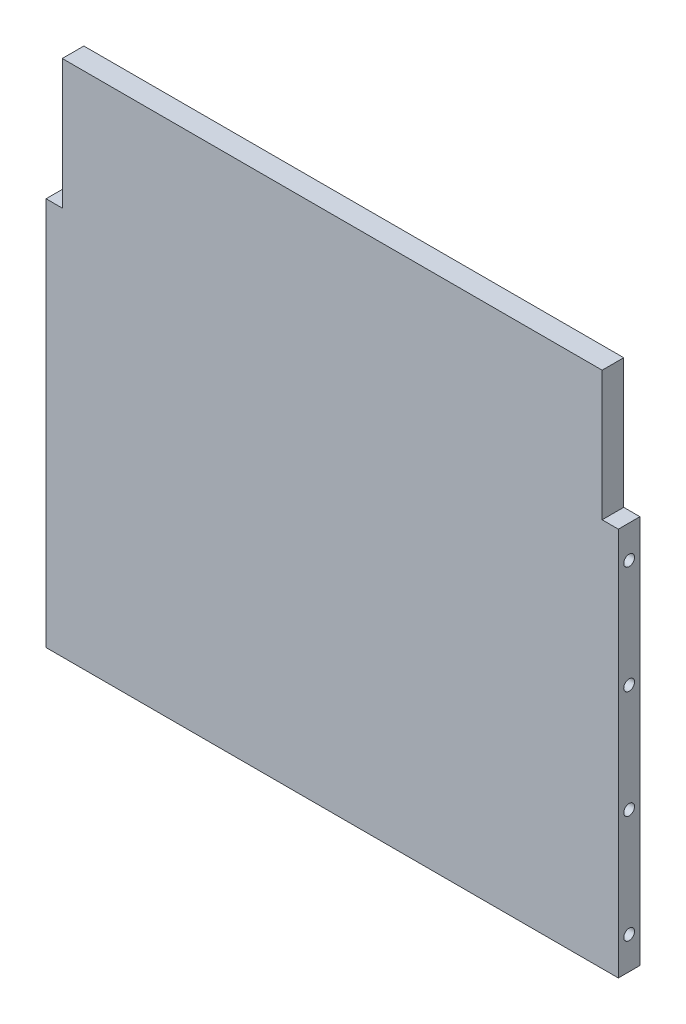
ISO-10303-21;
HEADER;
FILE_DESCRIPTION(('STEP AP214'),'2;1');
FILE_NAME('part.step','',(''),(''),'','','');
FILE_SCHEMA(('AUTOMOTIVE_DESIGN { 1 0 10303 214 1 1 1 1 }'));
ENDSEC;
DATA;
#1=APPLICATION_CONTEXT('core data for automotive mechanical design processes');
#2=APPLICATION_PROTOCOL_DEFINITION('international standard','automotive_design',2000,#1);
#3=PRODUCT_CONTEXT('',#1,'mechanical');
#4=PRODUCT('Part','Part','',(#3));
#5=PRODUCT_RELATED_PRODUCT_CATEGORY('part','',(#4));
#6=PRODUCT_DEFINITION_FORMATION('','',#4);
#7=PRODUCT_DEFINITION_CONTEXT('part definition',#1,'design');
#8=PRODUCT_DEFINITION('design','',#6,#7);
#9=PRODUCT_DEFINITION_SHAPE('','',#8);
#10=(LENGTH_UNIT() NAMED_UNIT(*) SI_UNIT(.MILLI.,.METRE.));
#11=(NAMED_UNIT(*) PLANE_ANGLE_UNIT() SI_UNIT($,.RADIAN.));
#12=(NAMED_UNIT(*) SI_UNIT($,.STERADIAN.) SOLID_ANGLE_UNIT());
#13=UNCERTAINTY_MEASURE_WITH_UNIT(LENGTH_MEASURE(1.E-05),#10,'distance_accuracy_value','');
#14=(GEOMETRIC_REPRESENTATION_CONTEXT(3) GLOBAL_UNCERTAINTY_ASSIGNED_CONTEXT((#13)) GLOBAL_UNIT_ASSIGNED_CONTEXT((#10,
#11,#12)) REPRESENTATION_CONTEXT('',''));
#15=CARTESIAN_POINT('',(0.,0.,0.));
#16=DIRECTION('',(0.,0.,1.));
#17=DIRECTION('',(1.,0.,0.));
#18=AXIS2_PLACEMENT_3D('',#15,#16,#17);
#19=CARTESIAN_POINT('',(265.,120.,20.));
#20=DIRECTION('',(-1.,0.,0.));
#21=DIRECTION('',(0.,-1.,0.));
#22=AXIS2_PLACEMENT_3D('',#19,#20,#21);
#23=PLANE('',#22);
#24=CARTESIAN_POINT('',(265.,-210.,10.));
#25=DIRECTION('',(1.,0.,0.));
#26=DIRECTION('',(0.,1.,0.));
#27=AXIS2_PLACEMENT_3D('',#24,#25,#26);
#28=CIRCLE('',#27,5.);
#29=CARTESIAN_POINT('',(265.,-205.,10.));
#30=VERTEX_POINT('',#29);
#31=EDGE_CURVE('E232',#30,#30,#28,.T.);
#32=ORIENTED_EDGE('',*,*,#31,.F.);
#33=EDGE_LOOP('',(#32));
#34=FACE_BOUND('',#33,.T.);
#35=CARTESIAN_POINT('',(265.,-10.,10.));
#36=DIRECTION('',(1.,0.,0.));
#37=DIRECTION('',(0.,1.,0.));
#38=AXIS2_PLACEMENT_3D('',#35,#36,#37);
#39=CIRCLE('',#38,5.);
#40=CARTESIAN_POINT('',(265.,-5.00000000000001,10.));
#41=VERTEX_POINT('',#40);
#42=EDGE_CURVE('E224',#41,#41,#39,.T.);
#43=ORIENTED_EDGE('',*,*,#42,.F.);
#44=EDGE_LOOP('',(#43));
#45=FACE_BOUND('',#44,.T.);
#46=CARTESIAN_POINT('',(265.,-110.,10.));
#47=DIRECTION('',(1.,0.,0.));
#48=DIRECTION('',(0.,1.,0.));
#49=AXIS2_PLACEMENT_3D('',#46,#47,#48);
#50=CIRCLE('',#49,5.);
#51=CARTESIAN_POINT('',(265.,-105.,10.));
#52=VERTEX_POINT('',#51);
#53=EDGE_CURVE('E216',#52,#52,#50,.T.);
#54=ORIENTED_EDGE('',*,*,#53,.F.);
#55=EDGE_LOOP('',(#54));
#56=FACE_BOUND('',#55,.T.);
#57=CARTESIAN_POINT('',(265.,90.,10.));
#58=DIRECTION('',(1.,0.,0.));
#59=DIRECTION('',(0.,1.,0.));
#60=AXIS2_PLACEMENT_3D('',#57,#58,#59);
#61=CIRCLE('',#60,5.);
#62=CARTESIAN_POINT('',(265.,95.,10.));
#63=VERTEX_POINT('',#62);
#64=EDGE_CURVE('E207',#63,#63,#61,.T.);
#65=ORIENTED_EDGE('',*,*,#64,.F.);
#66=EDGE_LOOP('',(#65));
#67=FACE_BOUND('',#66,.T.);
#68=DIRECTION('',(0.,1.,0.));
#69=VECTOR('',#68,1.);
#70=CARTESIAN_POINT('',(265.,120.,0.));
#71=LINE('',#70,#69);
#72=CARTESIAN_POINT('',(265.,-240.,0.));
#73=VERTEX_POINT('',#72);
#74=CARTESIAN_POINT('',(265.,120.,0.));
#75=VERTEX_POINT('',#74);
#76=EDGE_CURVE('E140',#73,#75,#71,.T.);
#77=ORIENTED_EDGE('',*,*,#76,.T.);
#78=DIRECTION('',(0.,0.,-1.));
#79=VECTOR('',#78,1.);
#80=CARTESIAN_POINT('',(265.,120.,20.));
#81=LINE('',#80,#79);
#82=CARTESIAN_POINT('',(265.,120.,20.));
#83=VERTEX_POINT('',#82);
#84=EDGE_CURVE('E11',#83,#75,#81,.T.);
#85=ORIENTED_EDGE('',*,*,#84,.F.);
#86=DIRECTION('',(0.,1.,0.));
#87=VECTOR('',#86,1.);
#88=CARTESIAN_POINT('',(265.,120.,20.));
#89=LINE('',#88,#87);
#90=CARTESIAN_POINT('',(265.,-240.,20.));
#91=VERTEX_POINT('',#90);
#92=EDGE_CURVE('E163',#91,#83,#89,.T.);
#93=ORIENTED_EDGE('',*,*,#92,.F.);
#94=DIRECTION('',(0.,0.,-1.));
#95=VECTOR('',#94,1.);
#96=CARTESIAN_POINT('',(265.,-240.,20.));
#97=LINE('',#96,#95);
#98=EDGE_CURVE('E136',#91,#73,#97,.T.);
#99=ORIENTED_EDGE('',*,*,#98,.T.);
#100=EDGE_LOOP('',(#77,#85,#93,#99));
#101=FACE_BOUND('',#100,.T.);
#102=ADVANCED_FACE('F39',(#34,#45,#56,#67,#101),#23,.F.);
#103=CARTESIAN_POINT('',(265.,120.,20.));
#104=DIRECTION('',(0.,-1.,0.));
#105=DIRECTION('',(0.,0.,-1.));
#106=AXIS2_PLACEMENT_3D('',#103,#104,#105);
#107=PLANE('',#106);
#108=DIRECTION('',(-1.,0.,0.));
#109=VECTOR('',#108,1.);
#110=CARTESIAN_POINT('',(265.,120.,0.));
#111=LINE('',#110,#109);
#112=CARTESIAN_POINT('',(250.,120.,0.));
#113=VERTEX_POINT('',#112);
#114=EDGE_CURVE('E144',#75,#113,#111,.T.);
#115=ORIENTED_EDGE('',*,*,#114,.T.);
#116=DIRECTION('',(0.,0.,-1.));
#117=VECTOR('',#116,1.);
#118=CARTESIAN_POINT('',(250.,120.,20.));
#119=LINE('',#118,#117);
#120=CARTESIAN_POINT('',(250.,120.,20.));
#121=VERTEX_POINT('',#120);
#122=EDGE_CURVE('E48',#121,#113,#119,.T.);
#123=ORIENTED_EDGE('',*,*,#122,.F.);
#124=DIRECTION('',(-1.,0.,0.));
#125=VECTOR('',#124,1.);
#126=CARTESIAN_POINT('',(265.,120.,20.));
#127=LINE('',#126,#125);
#128=EDGE_CURVE('E99',#83,#121,#127,.T.);
#129=ORIENTED_EDGE('',*,*,#128,.F.);
#130=ORIENTED_EDGE('',*,*,#84,.T.);
#131=EDGE_LOOP('',(#115,#123,#129,#130));
#132=FACE_BOUND('',#131,.T.);
#133=ADVANCED_FACE('F308',(#132),#107,.F.);
#134=CARTESIAN_POINT('',(250.,240.,20.));
#135=DIRECTION('',(-1.,0.,0.));
#136=DIRECTION('',(0.,0.,1.));
#137=AXIS2_PLACEMENT_3D('',#134,#135,#136);
#138=PLANE('',#137);
#139=DIRECTION('',(0.,1.,0.));
#140=VECTOR('',#139,1.);
#141=CARTESIAN_POINT('',(250.,240.,0.));
#142=LINE('',#141,#140);
#143=CARTESIAN_POINT('',(250.,240.,0.));
#144=VERTEX_POINT('',#143);
#145=EDGE_CURVE('E148',#113,#144,#142,.T.);
#146=ORIENTED_EDGE('',*,*,#145,.T.);
#147=DIRECTION('',(0.,0.,-1.));
#148=VECTOR('',#147,1.);
#149=CARTESIAN_POINT('',(250.,240.,20.));
#150=LINE('',#149,#148);
#151=CARTESIAN_POINT('',(250.,240.,20.));
#152=VERTEX_POINT('',#151);
#153=EDGE_CURVE('E174',#152,#144,#150,.T.);
#154=ORIENTED_EDGE('',*,*,#153,.F.);
#155=DIRECTION('',(0.,1.,0.));
#156=VECTOR('',#155,1.);
#157=CARTESIAN_POINT('',(250.,240.,20.));
#158=LINE('',#157,#156);
#159=EDGE_CURVE('E184',#121,#152,#158,.T.);
#160=ORIENTED_EDGE('',*,*,#159,.F.);
#161=ORIENTED_EDGE('',*,*,#122,.T.);
#162=EDGE_LOOP('',(#146,#154,#160,#161));
#163=FACE_BOUND('',#162,.T.);
#164=ADVANCED_FACE('F182',(#163),#138,.F.);
#165=CARTESIAN_POINT('',(-250.,240.,20.));
#166=DIRECTION('',(0.,-1.,0.));
#167=DIRECTION('',(0.,0.,-1.));
#168=AXIS2_PLACEMENT_3D('',#165,#166,#167);
#169=PLANE('',#168);
#170=DIRECTION('',(-1.,0.,0.));
#171=VECTOR('',#170,1.);
#172=CARTESIAN_POINT('',(-250.,240.,0.));
#173=LINE('',#172,#171);
#174=CARTESIAN_POINT('',(-250.,240.,0.));
#175=VERTEX_POINT('',#174);
#176=EDGE_CURVE('E151',#144,#175,#173,.T.);
#177=ORIENTED_EDGE('',*,*,#176,.T.);
#178=DIRECTION('',(0.,0.,-1.));
#179=VECTOR('',#178,1.);
#180=CARTESIAN_POINT('',(-250.,240.,20.));
#181=LINE('',#180,#179);
#182=CARTESIAN_POINT('',(-250.,240.,20.));
#183=VERTEX_POINT('',#182);
#184=EDGE_CURVE('E170',#183,#175,#181,.T.);
#185=ORIENTED_EDGE('',*,*,#184,.F.);
#186=DIRECTION('',(-1.,0.,0.));
#187=VECTOR('',#186,1.);
#188=CARTESIAN_POINT('',(-250.,240.,20.));
#189=LINE('',#188,#187);
#190=EDGE_CURVE('E197',#152,#183,#189,.T.);
#191=ORIENTED_EDGE('',*,*,#190,.F.);
#192=ORIENTED_EDGE('',*,*,#153,.T.);
#193=EDGE_LOOP('',(#177,#185,#191,#192));
#194=FACE_BOUND('',#193,.T.);
#195=ADVANCED_FACE('F192',(#194),#169,.F.);
#196=CARTESIAN_POINT('',(-250.,240.,20.));
#197=DIRECTION('',(1.,0.,0.));
#198=DIRECTION('',(0.,1.,0.));
#199=AXIS2_PLACEMENT_3D('',#196,#197,#198);
#200=PLANE('',#199);
#201=DIRECTION('',(0.,-1.,0.));
#202=VECTOR('',#201,1.);
#203=CARTESIAN_POINT('',(-250.,240.,0.));
#204=LINE('',#203,#202);
#205=CARTESIAN_POINT('',(-250.,120.,0.));
#206=VERTEX_POINT('',#205);
#207=EDGE_CURVE('E154',#175,#206,#204,.T.);
#208=ORIENTED_EDGE('',*,*,#207,.T.);
#209=DIRECTION('',(0.,0.,-1.));
#210=VECTOR('',#209,1.);
#211=CARTESIAN_POINT('',(-250.,120.,20.));
#212=LINE('',#211,#210);
#213=CARTESIAN_POINT('',(-250.,120.,20.));
#214=VERTEX_POINT('',#213);
#215=EDGE_CURVE('E129',#214,#206,#212,.T.);
#216=ORIENTED_EDGE('',*,*,#215,.F.);
#217=DIRECTION('',(0.,-1.,0.));
#218=VECTOR('',#217,1.);
#219=CARTESIAN_POINT('',(-250.,240.,20.));
#220=LINE('',#219,#218);
#221=EDGE_CURVE('E118',#183,#214,#220,.T.);
#222=ORIENTED_EDGE('',*,*,#221,.F.);
#223=ORIENTED_EDGE('',*,*,#184,.T.);
#224=EDGE_LOOP('',(#208,#216,#222,#223));
#225=FACE_BOUND('',#224,.T.);
#226=ADVANCED_FACE('F195',(#225),#200,.F.);
#227=CARTESIAN_POINT('',(-265.,120.,20.));
#228=DIRECTION('',(0.,-1.,0.));
#229=DIRECTION('',(0.,0.,-1.));
#230=AXIS2_PLACEMENT_3D('',#227,#228,#229);
#231=PLANE('',#230);
#232=DIRECTION('',(-1.,0.,0.));
#233=VECTOR('',#232,1.);
#234=CARTESIAN_POINT('',(-265.,120.,0.));
#235=LINE('',#234,#233);
#236=CARTESIAN_POINT('',(-265.,120.,0.));
#237=VERTEX_POINT('',#236);
#238=EDGE_CURVE('E127',#206,#237,#235,.T.);
#239=ORIENTED_EDGE('',*,*,#238,.T.);
#240=DIRECTION('',(0.,0.,-1.));
#241=VECTOR('',#240,1.);
#242=CARTESIAN_POINT('',(-265.,120.,20.));
#243=LINE('',#242,#241);
#244=CARTESIAN_POINT('',(-265.,120.,20.));
#245=VERTEX_POINT('',#244);
#246=EDGE_CURVE('E124',#245,#237,#243,.T.);
#247=ORIENTED_EDGE('',*,*,#246,.F.);
#248=DIRECTION('',(-1.,0.,0.));
#249=VECTOR('',#248,1.);
#250=CARTESIAN_POINT('',(-265.,120.,20.));
#251=LINE('',#250,#249);
#252=EDGE_CURVE('E112',#214,#245,#251,.T.);
#253=ORIENTED_EDGE('',*,*,#252,.F.);
#254=ORIENTED_EDGE('',*,*,#215,.T.);
#255=EDGE_LOOP('',(#239,#247,#253,#254));
#256=FACE_BOUND('',#255,.T.);
#257=ADVANCED_FACE('F125',(#256),#231,.F.);
#258=CARTESIAN_POINT('',(-265.,120.,20.));
#259=DIRECTION('',(1.,0.,0.));
#260=DIRECTION('',(0.,1.,0.));
#261=AXIS2_PLACEMENT_3D('',#258,#259,#260);
#262=PLANE('',#261);
#263=CARTESIAN_POINT('',(-265.,-210.,10.));
#264=DIRECTION('',(-1.,0.,0.));
#265=DIRECTION('',(0.,-1.,0.));
#266=AXIS2_PLACEMENT_3D('',#263,#264,#265);
#267=CIRCLE('',#266,5.);
#268=CARTESIAN_POINT('',(-265.,-215.,10.));
#269=VERTEX_POINT('',#268);
#270=EDGE_CURVE('E263',#269,#269,#267,.T.);
#271=ORIENTED_EDGE('',*,*,#270,.F.);
#272=EDGE_LOOP('',(#271));
#273=FACE_BOUND('',#272,.T.);
#274=CARTESIAN_POINT('',(-265.,-110.,10.));
#275=DIRECTION('',(-1.,0.,0.));
#276=DIRECTION('',(0.,-1.,0.));
#277=AXIS2_PLACEMENT_3D('',#274,#275,#276);
#278=CIRCLE('',#277,5.);
#279=CARTESIAN_POINT('',(-265.,-115.,10.));
#280=VERTEX_POINT('',#279);
#281=EDGE_CURVE('E255',#280,#280,#278,.T.);
#282=ORIENTED_EDGE('',*,*,#281,.F.);
#283=EDGE_LOOP('',(#282));
#284=FACE_BOUND('',#283,.T.);
#285=CARTESIAN_POINT('',(-265.,-10.,10.));
#286=DIRECTION('',(-1.,0.,0.));
#287=DIRECTION('',(0.,-1.,0.));
#288=AXIS2_PLACEMENT_3D('',#285,#286,#287);
#289=CIRCLE('',#288,5.);
#290=CARTESIAN_POINT('',(-265.,-15.,10.));
#291=VERTEX_POINT('',#290);
#292=EDGE_CURVE('E247',#291,#291,#289,.T.);
#293=ORIENTED_EDGE('',*,*,#292,.F.);
#294=EDGE_LOOP('',(#293));
#295=FACE_BOUND('',#294,.T.);
#296=CARTESIAN_POINT('',(-265.,90.,10.));
#297=DIRECTION('',(-1.,0.,0.));
#298=DIRECTION('',(0.,-1.,0.));
#299=AXIS2_PLACEMENT_3D('',#296,#297,#298);
#300=CIRCLE('',#299,5.);
#301=CARTESIAN_POINT('',(-265.,85.,10.));
#302=VERTEX_POINT('',#301);
#303=EDGE_CURVE('E239',#302,#302,#300,.T.);
#304=ORIENTED_EDGE('',*,*,#303,.F.);
#305=EDGE_LOOP('',(#304));
#306=FACE_BOUND('',#305,.T.);
#307=DIRECTION('',(0.,-1.,0.));
#308=VECTOR('',#307,1.);
#309=CARTESIAN_POINT('',(-265.,120.,0.));
#310=LINE('',#309,#308);
#311=CARTESIAN_POINT('',(-265.,-240.,0.));
#312=VERTEX_POINT('',#311);
#313=EDGE_CURVE('E85',#237,#312,#310,.T.);
#314=ORIENTED_EDGE('',*,*,#313,.T.);
#315=DIRECTION('',(0.,0.,-1.));
#316=VECTOR('',#315,1.);
#317=CARTESIAN_POINT('',(-265.,-240.,20.));
#318=LINE('',#317,#316);
#319=CARTESIAN_POINT('',(-265.,-240.,20.));
#320=VERTEX_POINT('',#319);
#321=EDGE_CURVE('E130',#320,#312,#318,.T.);
#322=ORIENTED_EDGE('',*,*,#321,.F.);
#323=DIRECTION('',(0.,-1.,0.));
#324=VECTOR('',#323,1.);
#325=CARTESIAN_POINT('',(-265.,120.,20.));
#326=LINE('',#325,#324);
#327=EDGE_CURVE('E116',#245,#320,#326,.T.);
#328=ORIENTED_EDGE('',*,*,#327,.F.);
#329=ORIENTED_EDGE('',*,*,#246,.T.);
#330=EDGE_LOOP('',(#314,#322,#328,#329));
#331=FACE_BOUND('',#330,.T.);
#332=ADVANCED_FACE('F132',(#273,#284,#295,#306,#331),#262,.F.);
#333=CARTESIAN_POINT('',(-265.,-240.,20.));
#334=DIRECTION('',(0.,1.,0.));
#335=DIRECTION('',(0.,0.,1.));
#336=AXIS2_PLACEMENT_3D('',#333,#334,#335);
#337=PLANE('',#336);
#338=DIRECTION('',(1.,0.,0.));
#339=VECTOR('',#338,1.);
#340=CARTESIAN_POINT('',(-265.,-240.,0.));
#341=LINE('',#340,#339);
#342=EDGE_CURVE('E91',#312,#73,#341,.T.);
#343=ORIENTED_EDGE('',*,*,#342,.T.);
#344=ORIENTED_EDGE('',*,*,#98,.F.);
#345=DIRECTION('',(1.,0.,0.));
#346=VECTOR('',#345,1.);
#347=CARTESIAN_POINT('',(-265.,-240.,20.));
#348=LINE('',#347,#346);
#349=EDGE_CURVE('E56',#320,#91,#348,.T.);
#350=ORIENTED_EDGE('',*,*,#349,.F.);
#351=ORIENTED_EDGE('',*,*,#321,.T.);
#352=EDGE_LOOP('',(#343,#344,#350,#351));
#353=FACE_BOUND('',#352,.T.);
#354=ADVANCED_FACE('F282',(#353),#337,.F.);
#355=CARTESIAN_POINT('',(0.,0.,20.));
#356=DIRECTION('',(0.,0.,1.));
#357=DIRECTION('',(1.,0.,0.));
#358=AXIS2_PLACEMENT_3D('',#355,#356,#357);
#359=PLANE('',#358);
#360=ORIENTED_EDGE('',*,*,#92,.T.);
#361=ORIENTED_EDGE('',*,*,#128,.T.);
#362=ORIENTED_EDGE('',*,*,#159,.T.);
#363=ORIENTED_EDGE('',*,*,#190,.T.);
#364=ORIENTED_EDGE('',*,*,#221,.T.);
#365=ORIENTED_EDGE('',*,*,#252,.T.);
#366=ORIENTED_EDGE('',*,*,#327,.T.);
#367=ORIENTED_EDGE('',*,*,#349,.T.);
#368=EDGE_LOOP('',(#360,#361,#362,#363,#364,#365,#366,#367));
#369=FACE_BOUND('',#368,.T.);
#370=ADVANCED_FACE('F114',(#369),#359,.T.);
#371=CARTESIAN_POINT('',(0.,0.,0.));
#372=DIRECTION('',(0.,0.,1.));
#373=DIRECTION('',(1.,0.,0.));
#374=AXIS2_PLACEMENT_3D('',#371,#372,#373);
#375=PLANE('',#374);
#376=ORIENTED_EDGE('',*,*,#76,.F.);
#377=ORIENTED_EDGE('',*,*,#342,.F.);
#378=ORIENTED_EDGE('',*,*,#313,.F.);
#379=ORIENTED_EDGE('',*,*,#238,.F.);
#380=ORIENTED_EDGE('',*,*,#207,.F.);
#381=ORIENTED_EDGE('',*,*,#176,.F.);
#382=ORIENTED_EDGE('',*,*,#145,.F.);
#383=ORIENTED_EDGE('',*,*,#114,.F.);
#384=EDGE_LOOP('',(#376,#377,#378,#379,#380,#381,#382,#383));
#385=FACE_BOUND('',#384,.T.);
#386=ADVANCED_FACE('F188',(#385),#375,.F.);
#387=CARTESIAN_POINT('',(235.,90.,10.));
#388=DIRECTION('',(1.,0.,0.));
#389=DIRECTION('',(0.,1.,0.));
#390=AXIS2_PLACEMENT_3D('',#387,#388,#389);
#391=CYLINDRICAL_SURFACE('',#390,5.);
#392=CARTESIAN_POINT('',(235.,90.,10.));
#393=DIRECTION('',(1.,0.,0.));
#394=DIRECTION('',(0.,1.,0.));
#395=AXIS2_PLACEMENT_3D('',#392,#393,#394);
#396=CIRCLE('',#395,5.);
#397=CARTESIAN_POINT('',(235.,95.,10.));
#398=VERTEX_POINT('',#397);
#399=EDGE_CURVE('E211',#398,#398,#396,.T.);
#400=ORIENTED_EDGE('',*,*,#399,.F.);
#401=EDGE_LOOP('',(#400));
#402=FACE_BOUND('',#401,.T.);
#403=ORIENTED_EDGE('',*,*,#64,.T.);
#404=EDGE_LOOP('',(#403));
#405=FACE_BOUND('',#404,.T.);
#406=ADVANCED_FACE('F485',(#402,#405),#391,.F.);
#407=CARTESIAN_POINT('',(235.,90.,10.));
#408=DIRECTION('',(1.,0.,0.));
#409=DIRECTION('',(0.,1.,0.));
#410=AXIS2_PLACEMENT_3D('',#407,#408,#409);
#411=PLANE('',#410);
#412=ORIENTED_EDGE('',*,*,#399,.T.);
#413=EDGE_LOOP('',(#412));
#414=FACE_BOUND('',#413,.T.);
#415=ADVANCED_FACE('F476',(#414),#411,.T.);
#416=CARTESIAN_POINT('',(235.,-110.,10.));
#417=DIRECTION('',(1.,0.,0.));
#418=DIRECTION('',(0.,1.,0.));
#419=AXIS2_PLACEMENT_3D('',#416,#417,#418);
#420=CYLINDRICAL_SURFACE('',#419,5.);
#421=CARTESIAN_POINT('',(235.,-110.,10.));
#422=DIRECTION('',(1.,0.,0.));
#423=DIRECTION('',(0.,1.,0.));
#424=AXIS2_PLACEMENT_3D('',#421,#422,#423);
#425=CIRCLE('',#424,5.);
#426=CARTESIAN_POINT('',(235.,-105.,10.));
#427=VERTEX_POINT('',#426);
#428=EDGE_CURVE('E220',#427,#427,#425,.T.);
#429=ORIENTED_EDGE('',*,*,#428,.F.);
#430=EDGE_LOOP('',(#429));
#431=FACE_BOUND('',#430,.T.);
#432=ORIENTED_EDGE('',*,*,#53,.T.);
#433=EDGE_LOOP('',(#432));
#434=FACE_BOUND('',#433,.T.);
#435=ADVANCED_FACE('F467',(#431,#434),#420,.F.);
#436=CARTESIAN_POINT('',(235.,-110.,10.));
#437=DIRECTION('',(1.,0.,0.));
#438=DIRECTION('',(0.,1.,0.));
#439=AXIS2_PLACEMENT_3D('',#436,#437,#438);
#440=PLANE('',#439);
#441=ORIENTED_EDGE('',*,*,#428,.T.);
#442=EDGE_LOOP('',(#441));
#443=FACE_BOUND('',#442,.T.);
#444=ADVANCED_FACE('F458',(#443),#440,.T.);
#445=CARTESIAN_POINT('',(235.,-10.,10.));
#446=DIRECTION('',(1.,0.,0.));
#447=DIRECTION('',(0.,1.,0.));
#448=AXIS2_PLACEMENT_3D('',#445,#446,#447);
#449=CYLINDRICAL_SURFACE('',#448,5.);
#450=CARTESIAN_POINT('',(235.,-10.,10.));
#451=DIRECTION('',(1.,0.,0.));
#452=DIRECTION('',(0.,1.,0.));
#453=AXIS2_PLACEMENT_3D('',#450,#451,#452);
#454=CIRCLE('',#453,5.);
#455=CARTESIAN_POINT('',(235.,-5.00000000000002,10.));
#456=VERTEX_POINT('',#455);
#457=EDGE_CURVE('E228',#456,#456,#454,.T.);
#458=ORIENTED_EDGE('',*,*,#457,.F.);
#459=EDGE_LOOP('',(#458));
#460=FACE_BOUND('',#459,.T.);
#461=ORIENTED_EDGE('',*,*,#42,.T.);
#462=EDGE_LOOP('',(#461));
#463=FACE_BOUND('',#462,.T.);
#464=ADVANCED_FACE('F449',(#460,#463),#449,.F.);
#465=CARTESIAN_POINT('',(235.,-10.,10.));
#466=DIRECTION('',(1.,0.,0.));
#467=DIRECTION('',(0.,1.,0.));
#468=AXIS2_PLACEMENT_3D('',#465,#466,#467);
#469=PLANE('',#468);
#470=ORIENTED_EDGE('',*,*,#457,.T.);
#471=EDGE_LOOP('',(#470));
#472=FACE_BOUND('',#471,.T.);
#473=ADVANCED_FACE('F440',(#472),#469,.T.);
#474=CARTESIAN_POINT('',(235.,-210.,10.));
#475=DIRECTION('',(1.,0.,0.));
#476=DIRECTION('',(0.,1.,0.));
#477=AXIS2_PLACEMENT_3D('',#474,#475,#476);
#478=CYLINDRICAL_SURFACE('',#477,5.);
#479=CARTESIAN_POINT('',(235.,-210.,10.));
#480=DIRECTION('',(1.,0.,0.));
#481=DIRECTION('',(0.,1.,0.));
#482=AXIS2_PLACEMENT_3D('',#479,#480,#481);
#483=CIRCLE('',#482,5.);
#484=CARTESIAN_POINT('',(235.,-205.,10.));
#485=VERTEX_POINT('',#484);
#486=EDGE_CURVE('E145',#485,#485,#483,.T.);
#487=ORIENTED_EDGE('',*,*,#486,.F.);
#488=EDGE_LOOP('',(#487));
#489=FACE_BOUND('',#488,.T.);
#490=ORIENTED_EDGE('',*,*,#31,.T.);
#491=EDGE_LOOP('',(#490));
#492=FACE_BOUND('',#491,.T.);
#493=ADVANCED_FACE('F303',(#489,#492),#478,.F.);
#494=CARTESIAN_POINT('',(235.,-210.,10.));
#495=DIRECTION('',(1.,0.,0.));
#496=DIRECTION('',(0.,1.,0.));
#497=AXIS2_PLACEMENT_3D('',#494,#495,#496);
#498=PLANE('',#497);
#499=ORIENTED_EDGE('',*,*,#486,.T.);
#500=EDGE_LOOP('',(#499));
#501=FACE_BOUND('',#500,.T.);
#502=ADVANCED_FACE('F293',(#501),#498,.T.);
#503=CARTESIAN_POINT('',(-235.,90.,10.));
#504=DIRECTION('',(-1.,0.,0.));
#505=DIRECTION('',(0.,-1.,0.));
#506=AXIS2_PLACEMENT_3D('',#503,#504,#505);
#507=CYLINDRICAL_SURFACE('',#506,5.);
#508=CARTESIAN_POINT('',(-235.,90.,10.));
#509=DIRECTION('',(-1.,0.,0.));
#510=DIRECTION('',(0.,-1.,0.));
#511=AXIS2_PLACEMENT_3D('',#508,#509,#510);
#512=CIRCLE('',#511,5.);
#513=CARTESIAN_POINT('',(-235.,85.,10.));
#514=VERTEX_POINT('',#513);
#515=EDGE_CURVE('E243',#514,#514,#512,.T.);
#516=ORIENTED_EDGE('',*,*,#515,.F.);
#517=EDGE_LOOP('',(#516));
#518=FACE_BOUND('',#517,.T.);
#519=ORIENTED_EDGE('',*,*,#303,.T.);
#520=EDGE_LOOP('',(#519));
#521=FACE_BOUND('',#520,.T.);
#522=ADVANCED_FACE('F290',(#518,#521),#507,.F.);
#523=CARTESIAN_POINT('',(-235.,90.,10.));
#524=DIRECTION('',(-1.,0.,0.));
#525=DIRECTION('',(0.,-1.,0.));
#526=AXIS2_PLACEMENT_3D('',#523,#524,#525);
#527=PLANE('',#526);
#528=ORIENTED_EDGE('',*,*,#515,.T.);
#529=EDGE_LOOP('',(#528));
#530=FACE_BOUND('',#529,.T.);
#531=ADVANCED_FACE('F292',(#530),#527,.T.);
#532=CARTESIAN_POINT('',(-235.,-10.,10.));
#533=DIRECTION('',(-1.,0.,0.));
#534=DIRECTION('',(0.,-1.,0.));
#535=AXIS2_PLACEMENT_3D('',#532,#533,#534);
#536=CYLINDRICAL_SURFACE('',#535,5.);
#537=CARTESIAN_POINT('',(-235.,-10.,10.));
#538=DIRECTION('',(-1.,0.,0.));
#539=DIRECTION('',(0.,-1.,0.));
#540=AXIS2_PLACEMENT_3D('',#537,#538,#539);
#541=CIRCLE('',#540,5.);
#542=CARTESIAN_POINT('',(-235.,-15.,10.));
#543=VERTEX_POINT('',#542);
#544=EDGE_CURVE('E251',#543,#543,#541,.T.);
#545=ORIENTED_EDGE('',*,*,#544,.F.);
#546=EDGE_LOOP('',(#545));
#547=FACE_BOUND('',#546,.T.);
#548=ORIENTED_EDGE('',*,*,#292,.T.);
#549=EDGE_LOOP('',(#548));
#550=FACE_BOUND('',#549,.T.);
#551=ADVANCED_FACE('F300',(#547,#550),#536,.F.);
#552=CARTESIAN_POINT('',(-235.,-10.,10.));
#553=DIRECTION('',(-1.,0.,0.));
#554=DIRECTION('',(0.,-1.,0.));
#555=AXIS2_PLACEMENT_3D('',#552,#553,#554);
#556=PLANE('',#555);
#557=ORIENTED_EDGE('',*,*,#544,.T.);
#558=EDGE_LOOP('',(#557));
#559=FACE_BOUND('',#558,.T.);
#560=ADVANCED_FACE('F382',(#559),#556,.T.);
#561=CARTESIAN_POINT('',(-235.,-110.,10.));
#562=DIRECTION('',(-1.,0.,0.));
#563=DIRECTION('',(0.,-1.,0.));
#564=AXIS2_PLACEMENT_3D('',#561,#562,#563);
#565=CYLINDRICAL_SURFACE('',#564,5.);
#566=CARTESIAN_POINT('',(-235.,-110.,10.));
#567=DIRECTION('',(-1.,0.,0.));
#568=DIRECTION('',(0.,-1.,0.));
#569=AXIS2_PLACEMENT_3D('',#566,#567,#568);
#570=CIRCLE('',#569,5.);
#571=CARTESIAN_POINT('',(-235.,-115.,10.));
#572=VERTEX_POINT('',#571);
#573=EDGE_CURVE('E259',#572,#572,#570,.T.);
#574=ORIENTED_EDGE('',*,*,#573,.F.);
#575=EDGE_LOOP('',(#574));
#576=FACE_BOUND('',#575,.T.);
#577=ORIENTED_EDGE('',*,*,#281,.T.);
#578=EDGE_LOOP('',(#577));
#579=FACE_BOUND('',#578,.T.);
#580=ADVANCED_FACE('F392',(#576,#579),#565,.F.);
#581=CARTESIAN_POINT('',(-235.,-110.,10.));
#582=DIRECTION('',(-1.,0.,0.));
#583=DIRECTION('',(0.,-1.,0.));
#584=AXIS2_PLACEMENT_3D('',#581,#582,#583);
#585=PLANE('',#584);
#586=ORIENTED_EDGE('',*,*,#573,.T.);
#587=EDGE_LOOP('',(#586));
#588=FACE_BOUND('',#587,.T.);
#589=ADVANCED_FACE('F276',(#588),#585,.T.);
#590=CARTESIAN_POINT('',(-235.,-210.,10.));
#591=DIRECTION('',(-1.,0.,0.));
#592=DIRECTION('',(0.,-1.,0.));
#593=AXIS2_PLACEMENT_3D('',#590,#591,#592);
#594=CYLINDRICAL_SURFACE('',#593,5.);
#595=CARTESIAN_POINT('',(-235.,-210.,10.));
#596=DIRECTION('',(-1.,0.,0.));
#597=DIRECTION('',(0.,-1.,0.));
#598=AXIS2_PLACEMENT_3D('',#595,#596,#597);
#599=CIRCLE('',#598,5.);
#600=CARTESIAN_POINT('',(-235.,-215.,10.));
#601=VERTEX_POINT('',#600);
#602=EDGE_CURVE('E212',#601,#601,#599,.T.);
#603=ORIENTED_EDGE('',*,*,#602,.F.);
#604=EDGE_LOOP('',(#603));
#605=FACE_BOUND('',#604,.T.);
#606=ORIENTED_EDGE('',*,*,#270,.T.);
#607=EDGE_LOOP('',(#606));
#608=FACE_BOUND('',#607,.T.);
#609=ADVANCED_FACE('F273',(#605,#608),#594,.F.);
#610=CARTESIAN_POINT('',(-235.,-210.,10.));
#611=DIRECTION('',(-1.,0.,0.));
#612=DIRECTION('',(0.,-1.,0.));
#613=AXIS2_PLACEMENT_3D('',#610,#611,#612);
#614=PLANE('',#613);
#615=ORIENTED_EDGE('',*,*,#602,.T.);
#616=EDGE_LOOP('',(#615));
#617=FACE_BOUND('',#616,.T.);
#618=ADVANCED_FACE('F271',(#617),#614,.T.);
#619=CLOSED_SHELL('',(#102,#133,#164,#195,#226,#257,#332,#354,#370,#386,#406,#415,#435,#444,
#464,#473,#493,#502,#522,#531,#551,#560,#580,#589,#609,#618));
#620=MANIFOLD_SOLID_BREP('B2',#619);
#621=ADVANCED_BREP_SHAPE_REPRESENTATION('',(#18,#620),#14);
#622=SHAPE_DEFINITION_REPRESENTATION(#9,#621);
ENDSEC;
END-ISO-10303-21;
